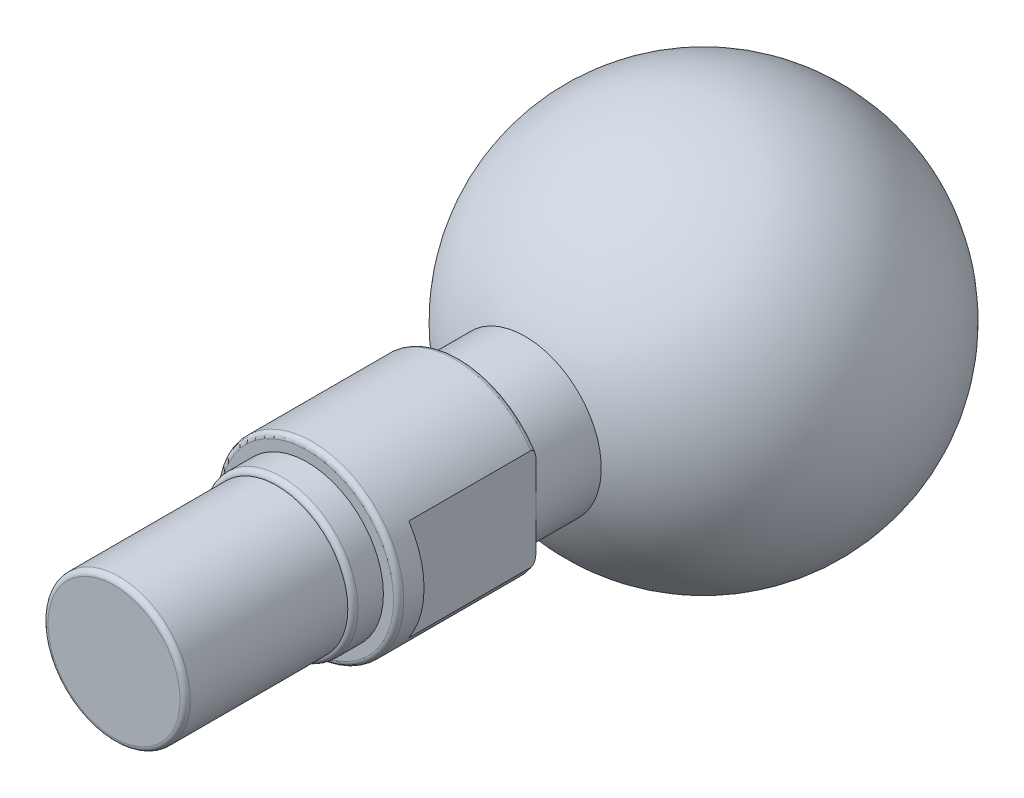
ISO-10303-21;
HEADER;
FILE_DESCRIPTION(('STEP AP214'),'2;1');
FILE_NAME('part.step','',(''),(''),'','','');
FILE_SCHEMA(('AUTOMOTIVE_DESIGN { 1 0 10303 214 1 1 1 1 }'));
ENDSEC;
DATA;
#1=APPLICATION_CONTEXT('core data for automotive mechanical design processes');
#2=APPLICATION_PROTOCOL_DEFINITION('international standard','automotive_design',2000,#1);
#3=PRODUCT_CONTEXT('',#1,'mechanical');
#4=PRODUCT('Part','Part','',(#3));
#5=PRODUCT_RELATED_PRODUCT_CATEGORY('part','',(#4));
#6=PRODUCT_DEFINITION_FORMATION('','',#4);
#7=PRODUCT_DEFINITION_CONTEXT('part definition',#1,'design');
#8=PRODUCT_DEFINITION('design','',#6,#7);
#9=PRODUCT_DEFINITION_SHAPE('','',#8);
#10=(LENGTH_UNIT() NAMED_UNIT(*) SI_UNIT(.MILLI.,.METRE.));
#11=(NAMED_UNIT(*) PLANE_ANGLE_UNIT() SI_UNIT($,.RADIAN.));
#12=(NAMED_UNIT(*) SI_UNIT($,.STERADIAN.) SOLID_ANGLE_UNIT());
#13=UNCERTAINTY_MEASURE_WITH_UNIT(LENGTH_MEASURE(1.E-05),#10,'distance_accuracy_value','');
#14=(GEOMETRIC_REPRESENTATION_CONTEXT(3) GLOBAL_UNCERTAINTY_ASSIGNED_CONTEXT((#13)) GLOBAL_UNIT_ASSIGNED_CONTEXT((#10,
#11,#12)) REPRESENTATION_CONTEXT('',''));
#15=CARTESIAN_POINT('',(0.,0.,0.));
#16=DIRECTION('',(0.,0.,1.));
#17=DIRECTION('',(1.,0.,0.));
#18=AXIS2_PLACEMENT_3D('',#15,#16,#17);
#19=CARTESIAN_POINT('',(0.,0.,48.));
#20=DIRECTION('',(0.,0.,-1.));
#21=DIRECTION('',(-1.,0.,0.));
#22=AXIS2_PLACEMENT_3D('',#19,#20,#21);
#23=PLANE('',#22);
#24=DIRECTION('',(0.,-1.,0.));
#25=VECTOR('',#24,1.);
#26=CARTESIAN_POINT('',(-15.,0.,48.));
#27=LINE('',#26,#25);
#28=CARTESIAN_POINT('',(-15.,7.99999999999999,48.));
#29=VERTEX_POINT('',#28);
#30=CARTESIAN_POINT('',(-15.,0.,48.));
#31=VERTEX_POINT('',#30);
#32=EDGE_CURVE('E120',#29,#31,#27,.T.);
#33=ORIENTED_EDGE('',*,*,#32,.F.);
#34=CARTESIAN_POINT('',(0.,0.,48.));
#35=DIRECTION('',(0.,0.,-1.));
#36=DIRECTION('',(-1.,0.,0.));
#37=AXIS2_PLACEMENT_3D('',#34,#35,#36);
#38=CIRCLE('',#37,17.);
#39=CARTESIAN_POINT('',(15.,7.99999999999999,48.));
#40=VERTEX_POINT('',#39);
#41=EDGE_CURVE('E156',#29,#40,#38,.T.);
#42=ORIENTED_EDGE('',*,*,#41,.T.);
#43=DIRECTION('',(0.,1.,0.));
#44=VECTOR('',#43,1.);
#45=CARTESIAN_POINT('',(15.,0.,48.));
#46=LINE('',#45,#44);
#47=CARTESIAN_POINT('',(15.,0.,48.));
#48=VERTEX_POINT('',#47);
#49=EDGE_CURVE('E143',#48,#40,#46,.T.);
#50=ORIENTED_EDGE('',*,*,#49,.F.);
#51=CARTESIAN_POINT('',(0.,0.,48.));
#52=DIRECTION('',(0.,0.,-1.));
#53=DIRECTION('',(-1.,0.,0.));
#54=AXIS2_PLACEMENT_3D('',#51,#52,#53);
#55=CIRCLE('',#54,15.);
#56=EDGE_CURVE('E133',#31,#48,#55,.T.);
#57=ORIENTED_EDGE('',*,*,#56,.F.);
#58=EDGE_LOOP('',(#33,#42,#50,#57));
#59=FACE_BOUND('',#58,.T.);
#60=ADVANCED_FACE('F43',(#59),#23,.T.);
#61=CARTESIAN_POINT('',(0.,0.,48.));
#62=DIRECTION('',(0.,0.,-1.));
#63=DIRECTION('',(-1.,0.,0.));
#64=AXIS2_PLACEMENT_3D('',#61,#62,#63);
#65=CYLINDRICAL_SURFACE('',#64,15.);
#66=ORIENTED_EDGE('',*,*,#56,.T.);
#67=EDGE_CURVE('E137',#48,#31,#55,.T.);
#68=ORIENTED_EDGE('',*,*,#67,.T.);
#69=EDGE_LOOP('',(#66,#68));
#70=FACE_BOUND('',#69,.T.);
#71=CARTESIAN_POINT('',(0.,0.,35.1317520200744));
#72=DIRECTION('',(0.,0.,-1.));
#73=DIRECTION('',(-1.,0.,0.));
#74=AXIS2_PLACEMENT_3D('',#71,#72,#73);
#75=CIRCLE('',#74,15.);
#76=CARTESIAN_POINT('',(-15.,0.,35.1317520200744));
#77=VERTEX_POINT('',#76);
#78=EDGE_CURVE('E132',#77,#77,#75,.F.);
#79=ORIENTED_EDGE('',*,*,#78,.T.);
#80=EDGE_LOOP('',(#79));
#81=FACE_BOUND('',#80,.T.);
#82=ADVANCED_FACE('F184',(#70,#81),#65,.T.);
#83=CARTESIAN_POINT('',(0.,0.,116.));
#84=DIRECTION('',(0.,0.,-1.));
#85=DIRECTION('',(-1.,0.,0.));
#86=AXIS2_PLACEMENT_3D('',#83,#84,#85);
#87=CYLINDRICAL_SURFACE('',#86,18.);
#88=CARTESIAN_POINT('',(0.,0.,77.));
#89=DIRECTION('',(0.,0.,1.));
#90=DIRECTION('',(1.,0.,0.));
#91=AXIS2_PLACEMENT_3D('',#88,#89,#90);
#92=CIRCLE('',#91,18.);
#93=CARTESIAN_POINT('',(18.,0.,77.));
#94=VERTEX_POINT('',#93);
#95=EDGE_CURVE('E166',#94,#94,#92,.F.);
#96=ORIENTED_EDGE('',*,*,#95,.T.);
#97=EDGE_LOOP('',(#96));
#98=FACE_BOUND('',#97,.T.);
#99=DIRECTION('',(0.,0.,-1.));
#100=VECTOR('',#99,1.);
#101=CARTESIAN_POINT('',(-15.,-9.9498743710662,116.));
#102=LINE('',#101,#100);
#103=CARTESIAN_POINT('',(-15.,-9.9498743710662,73.));
#104=VERTEX_POINT('',#103);
#105=CARTESIAN_POINT('',(-15.,-9.9498743710662,49.));
#106=VERTEX_POINT('',#105);
#107=EDGE_CURVE('E130',#104,#106,#102,.T.);
#108=ORIENTED_EDGE('',*,*,#107,.T.);
#109=CARTESIAN_POINT('',(0.,0.,49.));
#110=DIRECTION('',(0.,0.,-1.));
#111=DIRECTION('',(-1.,0.,0.));
#112=AXIS2_PLACEMENT_3D('',#109,#110,#111);
#113=CIRCLE('',#112,18.);
#114=CARTESIAN_POINT('',(15.,-9.9498743710662,49.));
#115=VERTEX_POINT('',#114);
#116=EDGE_CURVE('E57',#106,#115,#113,.F.);
#117=ORIENTED_EDGE('',*,*,#116,.T.);
#118=DIRECTION('',(0.,0.,-1.));
#119=VECTOR('',#118,1.);
#120=CARTESIAN_POINT('',(15.,-9.9498743710662,116.));
#121=LINE('',#120,#119);
#122=CARTESIAN_POINT('',(15.,-9.9498743710662,73.));
#123=VERTEX_POINT('',#122);
#124=EDGE_CURVE('E104',#115,#123,#121,.F.);
#125=ORIENTED_EDGE('',*,*,#124,.T.);
#126=CARTESIAN_POINT('',(0.,0.,73.));
#127=DIRECTION('',(0.,0.,-1.));
#128=DIRECTION('',(-1.,0.,0.));
#129=AXIS2_PLACEMENT_3D('',#126,#127,#128);
#130=CIRCLE('',#129,18.);
#131=CARTESIAN_POINT('',(15.,9.9498743710662,73.));
#132=VERTEX_POINT('',#131);
#133=EDGE_CURVE('E108',#132,#123,#130,.T.);
#134=ORIENTED_EDGE('',*,*,#133,.F.);
#135=DIRECTION('',(0.,0.,-1.));
#136=VECTOR('',#135,1.);
#137=CARTESIAN_POINT('',(15.,9.9498743710662,116.));
#138=LINE('',#137,#136);
#139=CARTESIAN_POINT('',(15.,9.9498743710662,49.));
#140=VERTEX_POINT('',#139);
#141=EDGE_CURVE('E112',#132,#140,#138,.T.);
#142=ORIENTED_EDGE('',*,*,#141,.T.);
#143=CARTESIAN_POINT('',(0.,0.,49.));
#144=DIRECTION('',(0.,0.,-1.));
#145=DIRECTION('',(-1.,0.,0.));
#146=AXIS2_PLACEMENT_3D('',#143,#144,#145);
#147=CIRCLE('',#146,18.);
#148=CARTESIAN_POINT('',(-15.,9.9498743710662,49.));
#149=VERTEX_POINT('',#148);
#150=EDGE_CURVE('E233',#140,#149,#147,.F.);
#151=ORIENTED_EDGE('',*,*,#150,.T.);
#152=DIRECTION('',(0.,0.,-1.));
#153=VECTOR('',#152,1.);
#154=CARTESIAN_POINT('',(-15.,9.9498743710662,116.));
#155=LINE('',#154,#153);
#156=CARTESIAN_POINT('',(-15.,9.9498743710662,73.));
#157=VERTEX_POINT('',#156);
#158=EDGE_CURVE('E128',#149,#157,#155,.F.);
#159=ORIENTED_EDGE('',*,*,#158,.T.);
#160=CARTESIAN_POINT('',(0.,0.,73.));
#161=DIRECTION('',(0.,0.,1.));
#162=DIRECTION('',(1.,0.,0.));
#163=AXIS2_PLACEMENT_3D('',#160,#161,#162);
#164=CIRCLE('',#163,18.);
#165=EDGE_CURVE('E119',#157,#104,#164,.T.);
#166=ORIENTED_EDGE('',*,*,#165,.T.);
#167=EDGE_LOOP('',(#108,#117,#125,#134,#142,#151,#159,#166));
#168=FACE_BOUND('',#167,.T.);
#169=ADVANCED_FACE('F106',(#98,#168),#87,.T.);
#170=CARTESIAN_POINT('',(0.,0.,78.));
#171=DIRECTION('',(0.,0.,1.));
#172=DIRECTION('',(1.,0.,0.));
#173=AXIS2_PLACEMENT_3D('',#170,#171,#172);
#174=CYLINDRICAL_SURFACE('',#173,15.);
#175=CARTESIAN_POINT('',(0.,0.,83.));
#176=DIRECTION('',(0.,0.,1.));
#177=DIRECTION('',(1.,0.,0.));
#178=AXIS2_PLACEMENT_3D('',#175,#176,#177);
#179=CIRCLE('',#178,15.);
#180=CARTESIAN_POINT('',(15.,0.,83.));
#181=VERTEX_POINT('',#180);
#182=EDGE_CURVE('E153',#181,#181,#179,.F.);
#183=ORIENTED_EDGE('',*,*,#182,.T.);
#184=EDGE_LOOP('',(#183));
#185=FACE_BOUND('',#184,.T.);
#186=CARTESIAN_POINT('',(0.,0.,78.));
#187=DIRECTION('',(0.,0.,1.));
#188=DIRECTION('',(1.,0.,0.));
#189=AXIS2_PLACEMENT_3D('',#186,#187,#188);
#190=CIRCLE('',#189,15.);
#191=CARTESIAN_POINT('',(15.,0.,78.));
#192=VERTEX_POINT('',#191);
#193=EDGE_CURVE('E140',#192,#192,#190,.T.);
#194=ORIENTED_EDGE('',*,*,#193,.T.);
#195=EDGE_LOOP('',(#194));
#196=FACE_BOUND('',#195,.T.);
#197=ADVANCED_FACE('F197',(#185,#196),#174,.T.);
#198=CARTESIAN_POINT('',(0.,0.,78.));
#199=DIRECTION('',(0.,0.,1.));
#200=DIRECTION('',(1.,0.,0.));
#201=AXIS2_PLACEMENT_3D('',#198,#199,#200);
#202=PLANE('',#201);
#203=CARTESIAN_POINT('',(0.,0.,78.));
#204=DIRECTION('',(0.,0.,1.));
#205=DIRECTION('',(1.,0.,0.));
#206=AXIS2_PLACEMENT_3D('',#203,#204,#205);
#207=CIRCLE('',#206,17.);
#208=CARTESIAN_POINT('',(17.,0.,78.));
#209=VERTEX_POINT('',#208);
#210=EDGE_CURVE('E258',#209,#209,#207,.T.);
#211=ORIENTED_EDGE('',*,*,#210,.T.);
#212=EDGE_LOOP('',(#211));
#213=FACE_BOUND('',#212,.T.);
#214=ORIENTED_EDGE('',*,*,#193,.F.);
#215=EDGE_LOOP('',(#214));
#216=FACE_BOUND('',#215,.T.);
#217=ADVANCED_FACE('F195',(#213,#216),#202,.T.);
#218=CARTESIAN_POINT('',(0.,0.,84.));
#219=DIRECTION('',(0.,0.,1.));
#220=DIRECTION('',(1.,0.,0.));
#221=AXIS2_PLACEMENT_3D('',#218,#219,#220);
#222=CYLINDRICAL_SURFACE('',#221,14.);
#223=CARTESIAN_POINT('',(0.,0.,115.));
#224=DIRECTION('',(0.,0.,1.));
#225=DIRECTION('',(1.,0.,0.));
#226=AXIS2_PLACEMENT_3D('',#223,#224,#225);
#227=CIRCLE('',#226,14.);
#228=CARTESIAN_POINT('',(14.,0.,115.));
#229=VERTEX_POINT('',#228);
#230=EDGE_CURVE('E263',#229,#229,#227,.F.);
#231=ORIENTED_EDGE('',*,*,#230,.T.);
#232=EDGE_LOOP('',(#231));
#233=FACE_BOUND('',#232,.T.);
#234=CARTESIAN_POINT('',(0.,0.,84.));
#235=DIRECTION('',(0.,0.,1.));
#236=DIRECTION('',(1.,0.,0.));
#237=AXIS2_PLACEMENT_3D('',#234,#235,#236);
#238=CIRCLE('',#237,14.);
#239=CARTESIAN_POINT('',(14.,0.,84.));
#240=VERTEX_POINT('',#239);
#241=EDGE_CURVE('E136',#240,#240,#238,.T.);
#242=ORIENTED_EDGE('',*,*,#241,.T.);
#243=EDGE_LOOP('',(#242));
#244=FACE_BOUND('',#243,.T.);
#245=ADVANCED_FACE('F192',(#233,#244),#222,.T.);
#246=CARTESIAN_POINT('',(0.,0.,116.));
#247=DIRECTION('',(0.,0.,1.));
#248=DIRECTION('',(1.,0.,0.));
#249=AXIS2_PLACEMENT_3D('',#246,#247,#248);
#250=PLANE('',#249);
#251=CARTESIAN_POINT('',(0.,0.,116.));
#252=DIRECTION('',(0.,0.,1.));
#253=DIRECTION('',(1.,0.,0.));
#254=AXIS2_PLACEMENT_3D('',#251,#252,#253);
#255=CIRCLE('',#254,13.);
#256=CARTESIAN_POINT('',(13.,0.,116.));
#257=VERTEX_POINT('',#256);
#258=EDGE_CURVE('E261',#257,#257,#255,.T.);
#259=ORIENTED_EDGE('',*,*,#258,.T.);
#260=EDGE_LOOP('',(#259));
#261=FACE_BOUND('',#260,.T.);
#262=ADVANCED_FACE('F190',(#261),#250,.T.);
#263=CARTESIAN_POINT('',(15.,-7.99999999999999,48.));
#264=VERTEX_POINT('',#263);
#265=EDGE_CURVE('E148',#264,#48,#46,.T.);
#266=ORIENTED_EDGE('',*,*,#265,.F.);
#267=CARTESIAN_POINT('',(0.,0.,48.));
#268=DIRECTION('',(0.,0.,-1.));
#269=DIRECTION('',(-1.,0.,0.));
#270=AXIS2_PLACEMENT_3D('',#267,#268,#269);
#271=CIRCLE('',#270,17.);
#272=CARTESIAN_POINT('',(-15.,-7.99999999999999,48.));
#273=VERTEX_POINT('',#272);
#274=EDGE_CURVE('E241',#264,#273,#271,.T.);
#275=ORIENTED_EDGE('',*,*,#274,.T.);
#276=EDGE_CURVE('E149',#31,#273,#27,.T.);
#277=ORIENTED_EDGE('',*,*,#276,.F.);
#278=ORIENTED_EDGE('',*,*,#67,.F.);
#279=EDGE_LOOP('',(#266,#275,#277,#278));
#280=FACE_BOUND('',#279,.T.);
#281=ADVANCED_FACE('F182',(#280),#23,.T.);
#282=CARTESIAN_POINT('',(0.,0.,0.));
#283=DIRECTION('',(0.,1.,0.));
#284=DIRECTION('',(-1.,0.,0.));
#285=AXIS2_PLACEMENT_3D('',#282,#283,#284);
#286=SPHERICAL_SURFACE('',#285,38.2);
#287=CARTESIAN_POINT('',(0.,0.,0.));
#288=DIRECTION('',(0.,0.,-1.));
#289=DIRECTION('',(-1.,0.,0.));
#290=AXIS2_PLACEMENT_3D('',#287,#288,#289);
#291=SPHERICAL_SURFACE('',#290,38.2);
#292=ORIENTED_EDGE('',*,*,#78,.F.);
#293=EDGE_LOOP('',(#292));
#294=FACE_BOUND('',#293,.T.);
#295=ADVANCED_FACE('F178',(#294),#291,.T.);
#296=CARTESIAN_POINT('',(0.,0.,73.));
#297=DIRECTION('',(0.,0.,-1.));
#298=DIRECTION('',(-1.,0.,0.));
#299=AXIS2_PLACEMENT_3D('',#296,#297,#298);
#300=PLANE('',#299);
#301=ORIENTED_EDGE('',*,*,#133,.T.);
#302=DIRECTION('',(0.,1.,0.));
#303=VECTOR('',#302,1.);
#304=CARTESIAN_POINT('',(15.,-37.868854143312,73.));
#305=LINE('',#304,#303);
#306=EDGE_CURVE('E118',#123,#132,#305,.T.);
#307=ORIENTED_EDGE('',*,*,#306,.T.);
#308=EDGE_LOOP('',(#301,#307));
#309=FACE_BOUND('',#308,.T.);
#310=ADVANCED_FACE('F117',(#309),#300,.T.);
#311=CARTESIAN_POINT('',(15.,0.,73.));
#312=DIRECTION('',(-1.,0.,0.));
#313=DIRECTION('',(0.,0.,1.));
#314=AXIS2_PLACEMENT_3D('',#311,#312,#313);
#315=PLANE('',#314);
#316=ORIENTED_EDGE('',*,*,#124,.F.);
#317=CARTESIAN_POINT('',(15.,-9.9498743710662,49.));
#318=CARTESIAN_POINT('',(15.,-9.94995092068547,48.9670104016146));
#319=CARTESIAN_POINT('',(15.,-9.94692576620746,48.9341030484418));
#320=CARTESIAN_POINT('',(15.,-9.935340034861,48.86955140071));
#321=CARTESIAN_POINT('',(15.,-9.92682641291096,48.8378987874545));
#322=CARTESIAN_POINT('',(15.,-9.90494267054541,48.7764569813644));
#323=CARTESIAN_POINT('',(15.,-9.89158627466595,48.7466627986246));
#324=CARTESIAN_POINT('',(15.,-9.86085445183833,48.689178639946));
#325=CARTESIAN_POINT('',(15.,-9.84347004976157,48.6614935492632));
#326=CARTESIAN_POINT('',(15.,-9.79306405669942,48.5910530607561));
#327=CARTESIAN_POINT('',(15.,-9.75725518298242,48.5502944985032));
#328=CARTESIAN_POINT('',(15.,-9.67977213133022,48.474803925843));
#329=CARTESIAN_POINT('',(15.,-9.63808239893143,48.4400884613369));
#330=CARTESIAN_POINT('',(15.,-9.55791381191183,48.3812738741146));
#331=CARTESIAN_POINT('',(15.,-9.52001697597254,48.356366491592));
#332=CARTESIAN_POINT('',(15.,-9.44220485638635,48.3099099583812));
#333=CARTESIAN_POINT('',(15.,-9.40228817549255,48.288363175672));
#334=CARTESIAN_POINT('',(15.,-9.28021748138049,48.2281411850536));
#335=CARTESIAN_POINT('',(15.,-9.19584289893816,48.1939534125173));
#336=CARTESIAN_POINT('',(15.,-9.03047350057519,48.1374840412098));
#337=CARTESIAN_POINT('',(15.,-8.9497079454855,48.1144959132503));
#338=CARTESIAN_POINT('',(15.,-8.7864581921727,48.0754482260719));
#339=CARTESIAN_POINT('',(15.,-8.70397249354183,48.0593950056331));
#340=CARTESIAN_POINT('',(15.,-8.53811653529296,48.0333167196097));
#341=CARTESIAN_POINT('',(15.,-8.45474665229676,48.0232891846372));
#342=CARTESIAN_POINT('',(15.,-8.28754112006985,48.0085695036277));
#343=CARTESIAN_POINT('',(15.,-8.20370547214922,48.0038773425912));
#344=CARTESIAN_POINT('',(15.,-8.09984208725256,48.0010694075162));
#345=CARTESIAN_POINT('',(15.,-8.07985843046174,48.0006667855147));
#346=CARTESIAN_POINT('',(15.,-8.03991683750419,48.0001322507617));
#347=CARTESIAN_POINT('',(15.,-8.01995890666298,47.9999999413284));
#348=CARTESIAN_POINT('',(15.,-7.99999999999999,48.));
#349=B_SPLINE_CURVE_WITH_KNOTS('',3,(#317,#318,#319,#320,#321,#322,#323,#324,#325,#326,#327,
#328,#329,#330,#331,#332,#333,#334,#335,#336,#337,#338,#339,#340,#341,#342,#343,#344,#345,#346,
#347,#348),.UNSPECIFIED.,.F.,.F.,(4,2,2,2,2,2,2,2,2,2,2,2,2,2,2,4),(0.,0.0986996653338462,
0.196565944000477,0.294157007880505,0.391967649816215,0.553799433585078,0.716067569401041,
0.851921403090914,0.987870535129685,1.26012968437189,1.51173247577786,1.76356475799105,
2.01529376623782,2.26702206679281,2.32698441529393,2.38685870606055),.UNSPECIFIED.);
#350=EDGE_CURVE('E11',#115,#264,#349,.T.);
#351=ORIENTED_EDGE('',*,*,#350,.T.);
#352=ORIENTED_EDGE('',*,*,#265,.T.);
#353=ORIENTED_EDGE('',*,*,#49,.T.);
#354=CARTESIAN_POINT('',(15.,7.99999999999999,48.));
#355=CARTESIAN_POINT('',(15.,8.08388043308083,48.0000301285647));
#356=CARTESIAN_POINT('',(15.,8.16779721708657,48.0023404220549));
#357=CARTESIAN_POINT('',(15.,8.33557003476502,48.0120827100263));
#358=CARTESIAN_POINT('',(15.,8.41942519548885,48.0195294541275));
#359=CARTESIAN_POINT('',(15.,8.58694845254498,48.0401732366046));
#360=CARTESIAN_POINT('',(15.,8.6706124909832,48.0534041116134));
#361=CARTESIAN_POINT('',(15.,8.83655530782762,48.0864390853219));
#362=CARTESIAN_POINT('',(15.,8.91883577516349,48.1062344493247));
#363=CARTESIAN_POINT('',(15.,9.06405890014056,48.1485582391874));
#364=CARTESIAN_POINT('',(15.,9.12742247468199,48.1696314549044));
#365=CARTESIAN_POINT('',(15.,9.2520438292776,48.2173551503201));
#366=CARTESIAN_POINT('',(15.,9.31330195457422,48.2440047105052));
#367=CARTESIAN_POINT('',(15.,9.43304054144105,48.3040913888168));
#368=CARTESIAN_POINT('',(15.,9.49149584844016,48.3375794215359));
#369=CARTESIAN_POINT('',(15.,9.6031495939962,48.4124735848139));
#370=CARTESIAN_POINT('',(15.,9.65635784394322,48.4538644951771));
#371=CARTESIAN_POINT('',(15.,9.7354478582526,48.5282611252012));
#372=CARTESIAN_POINT('',(15.,9.76399712406904,48.5584181186283));
#373=CARTESIAN_POINT('',(15.,9.81660127804363,48.6224705324718));
#374=CARTESIAN_POINT('',(15.,9.84065975529899,48.6563629327451));
#375=CARTESIAN_POINT('',(15.,9.87957559354778,48.7224129512661));
#376=CARTESIAN_POINT('',(15.,9.89527083640601,48.7540722987884));
#377=CARTESIAN_POINT('',(15.,9.92117447432434,48.8195375536959));
#378=CARTESIAN_POINT('',(15.,9.93139647419635,48.853337902867));
#379=CARTESIAN_POINT('',(15.,9.94221243884038,48.9062071171034));
#380=CARTESIAN_POINT('',(15.,9.94507308522225,48.9248308600835));
#381=CARTESIAN_POINT('',(15.,9.94890869835182,48.9622984646423));
#382=CARTESIAN_POINT('',(15.,9.94988088343938,48.9811426098594));
#383=CARTESIAN_POINT('',(15.,9.9498743710662,49.));
#384=B_SPLINE_CURVE_WITH_KNOTS('',3,(#354,#355,#356,#357,#358,#359,#360,#361,#362,#363,#364,
#365,#366,#367,#368,#369,#370,#371,#372,#373,#374,#375,#376,#377,#378,#379,#380,#381,#382,#383),
.UNSPECIFIED.,.F.,.F.,(4,2,2,2,2,2,2,2,2,2,2,2,2,2,4),(0.,0.251665998590591,0.504057696012981,
0.757946042855831,1.01149791283583,1.21161383770568,1.41169679034393,1.61332761313456,
1.81457396105758,1.9388408768163,2.06300804756233,2.16861049642969,2.27394921667853,
2.33038892897095,2.38691171281139),.UNSPECIFIED.);
#385=EDGE_CURVE('E159',#40,#140,#384,.T.);
#386=ORIENTED_EDGE('',*,*,#385,.T.);
#387=ORIENTED_EDGE('',*,*,#141,.F.);
#388=ORIENTED_EDGE('',*,*,#306,.F.);
#389=EDGE_LOOP('',(#316,#351,#352,#353,#386,#387,#388));
#390=FACE_BOUND('',#389,.T.);
#391=ADVANCED_FACE('F122',(#390),#315,.F.);
#392=CARTESIAN_POINT('',(0.,0.,73.));
#393=DIRECTION('',(0.,0.,1.));
#394=DIRECTION('',(1.,0.,0.));
#395=AXIS2_PLACEMENT_3D('',#392,#393,#394);
#396=PLANE('',#395);
#397=DIRECTION('',(0.,-1.,0.));
#398=VECTOR('',#397,1.);
#399=CARTESIAN_POINT('',(-15.,-37.868854143312,73.));
#400=LINE('',#399,#398);
#401=EDGE_CURVE('E113',#157,#104,#400,.T.);
#402=ORIENTED_EDGE('',*,*,#401,.T.);
#403=ORIENTED_EDGE('',*,*,#165,.F.);
#404=EDGE_LOOP('',(#402,#403));
#405=FACE_BOUND('',#404,.T.);
#406=ADVANCED_FACE('F176',(#405),#396,.F.);
#407=CARTESIAN_POINT('',(-15.,0.,73.));
#408=DIRECTION('',(1.,0.,0.));
#409=DIRECTION('',(0.,0.,-1.));
#410=AXIS2_PLACEMENT_3D('',#407,#408,#409);
#411=PLANE('',#410);
#412=ORIENTED_EDGE('',*,*,#276,.T.);
#413=CARTESIAN_POINT('',(-15.,-7.99999999999999,48.));
#414=CARTESIAN_POINT('',(-15.,-8.08388043308083,48.0000301285647));
#415=CARTESIAN_POINT('',(-15.,-8.16779721708657,48.0023404220549));
#416=CARTESIAN_POINT('',(-15.,-8.33557003476502,48.0120827100263));
#417=CARTESIAN_POINT('',(-15.,-8.41942519548885,48.0195294541275));
#418=CARTESIAN_POINT('',(-15.,-8.58694845254498,48.0401732366046));
#419=CARTESIAN_POINT('',(-15.,-8.6706124909832,48.0534041116134));
#420=CARTESIAN_POINT('',(-15.,-8.83655530782762,48.0864390853219));
#421=CARTESIAN_POINT('',(-15.,-8.91883577516349,48.1062344493247));
#422=CARTESIAN_POINT('',(-15.,-9.06405890014056,48.1485582391874));
#423=CARTESIAN_POINT('',(-15.,-9.12742247468199,48.1696314549044));
#424=CARTESIAN_POINT('',(-15.,-9.2520438292776,48.2173551503201));
#425=CARTESIAN_POINT('',(-15.,-9.31330195457422,48.2440047105052));
#426=CARTESIAN_POINT('',(-15.,-9.43304054144105,48.3040913888168));
#427=CARTESIAN_POINT('',(-15.,-9.49149584844016,48.3375794215359));
#428=CARTESIAN_POINT('',(-15.,-9.6031495939962,48.4124735848139));
#429=CARTESIAN_POINT('',(-15.,-9.65635784394322,48.4538644951771));
#430=CARTESIAN_POINT('',(-15.,-9.7354478582526,48.5282611252012));
#431=CARTESIAN_POINT('',(-15.,-9.76399712406904,48.5584181186283));
#432=CARTESIAN_POINT('',(-15.,-9.81660127804363,48.6224705324718));
#433=CARTESIAN_POINT('',(-15.,-9.84065975529899,48.6563629327451));
#434=CARTESIAN_POINT('',(-15.,-9.87957559354778,48.7224129512661));
#435=CARTESIAN_POINT('',(-15.,-9.89527083640601,48.7540722987884));
#436=CARTESIAN_POINT('',(-15.,-9.92117447432434,48.8195375536959));
#437=CARTESIAN_POINT('',(-15.,-9.93139647419635,48.853337902867));
#438=CARTESIAN_POINT('',(-15.,-9.94221243884038,48.9062071171034));
#439=CARTESIAN_POINT('',(-15.,-9.94507308522225,48.9248308600835));
#440=CARTESIAN_POINT('',(-15.,-9.94890869835182,48.9622984646423));
#441=CARTESIAN_POINT('',(-15.,-9.94988088343938,48.9811426098594));
#442=CARTESIAN_POINT('',(-15.,-9.9498743710662,49.));
#443=B_SPLINE_CURVE_WITH_KNOTS('',3,(#413,#414,#415,#416,#417,#418,#419,#420,#421,#422,#423,
#424,#425,#426,#427,#428,#429,#430,#431,#432,#433,#434,#435,#436,#437,#438,#439,#440,#441,#442),
.UNSPECIFIED.,.F.,.F.,(4,2,2,2,2,2,2,2,2,2,2,2,2,2,4),(0.,0.251665998590591,0.504057696012981,
0.757946042855831,1.01149791283583,1.21161383770568,1.41169679034393,1.61332761313456,
1.81457396105758,1.9388408768163,2.06300804756233,2.16861049642969,2.27394921667853,
2.33038892897095,2.38691171281139),.UNSPECIFIED.);
#444=EDGE_CURVE('E71',#273,#106,#443,.T.);
#445=ORIENTED_EDGE('',*,*,#444,.T.);
#446=ORIENTED_EDGE('',*,*,#107,.F.);
#447=ORIENTED_EDGE('',*,*,#401,.F.);
#448=ORIENTED_EDGE('',*,*,#158,.F.);
#449=CARTESIAN_POINT('',(-15.,9.9498743710662,49.));
#450=CARTESIAN_POINT('',(-15.,9.94995092068547,48.9670104016146));
#451=CARTESIAN_POINT('',(-15.,9.94692576620746,48.9341030484418));
#452=CARTESIAN_POINT('',(-15.,9.935340034861,48.86955140071));
#453=CARTESIAN_POINT('',(-15.,9.92682641291096,48.8378987874545));
#454=CARTESIAN_POINT('',(-15.,9.90494267054541,48.7764569813644));
#455=CARTESIAN_POINT('',(-15.,9.89158627466595,48.7466627986246));
#456=CARTESIAN_POINT('',(-15.,9.86085445183833,48.689178639946));
#457=CARTESIAN_POINT('',(-15.,9.84347004976157,48.6614935492632));
#458=CARTESIAN_POINT('',(-15.,9.79306405669942,48.5910530607561));
#459=CARTESIAN_POINT('',(-15.,9.75725518298242,48.5502944985032));
#460=CARTESIAN_POINT('',(-15.,9.67977213133022,48.474803925843));
#461=CARTESIAN_POINT('',(-15.,9.63808239893143,48.4400884613369));
#462=CARTESIAN_POINT('',(-15.,9.55791381191183,48.3812738741146));
#463=CARTESIAN_POINT('',(-15.,9.52001697597254,48.356366491592));
#464=CARTESIAN_POINT('',(-15.,9.44220485638635,48.3099099583812));
#465=CARTESIAN_POINT('',(-15.,9.40228817549255,48.288363175672));
#466=CARTESIAN_POINT('',(-15.,9.28021748138049,48.2281411850536));
#467=CARTESIAN_POINT('',(-15.,9.19584289893816,48.1939534125173));
#468=CARTESIAN_POINT('',(-15.,9.03047350057519,48.1374840412098));
#469=CARTESIAN_POINT('',(-15.,8.9497079454855,48.1144959132503));
#470=CARTESIAN_POINT('',(-15.,8.7864581921727,48.0754482260719));
#471=CARTESIAN_POINT('',(-15.,8.70397249354183,48.0593950056331));
#472=CARTESIAN_POINT('',(-15.,8.53811653529296,48.0333167196097));
#473=CARTESIAN_POINT('',(-15.,8.45474665229676,48.0232891846372));
#474=CARTESIAN_POINT('',(-15.,8.28754112006985,48.0085695036277));
#475=CARTESIAN_POINT('',(-15.,8.20370547214922,48.0038773425912));
#476=CARTESIAN_POINT('',(-15.,8.09984208725256,48.0010694075162));
#477=CARTESIAN_POINT('',(-15.,8.07985843046174,48.0006667855147));
#478=CARTESIAN_POINT('',(-15.,8.03991683750419,48.0001322507617));
#479=CARTESIAN_POINT('',(-15.,8.01995890666298,47.9999999413284));
#480=CARTESIAN_POINT('',(-15.,7.99999999999999,48.));
#481=B_SPLINE_CURVE_WITH_KNOTS('',3,(#449,#450,#451,#452,#453,#454,#455,#456,#457,#458,#459,
#460,#461,#462,#463,#464,#465,#466,#467,#468,#469,#470,#471,#472,#473,#474,#475,#476,#477,#478,
#479,#480),.UNSPECIFIED.,.F.,.F.,(4,2,2,2,2,2,2,2,2,2,2,2,2,2,2,4),(0.,0.0986996653338462,
0.196565944000477,0.294157007880505,0.391967649816215,0.553799433585078,0.716067569401041,
0.851921403090914,0.987870535129685,1.26012968437189,1.51173247577786,1.76356475799105,
2.01529376623782,2.26702206679281,2.32698441529393,2.38685870606055),.UNSPECIFIED.);
#482=EDGE_CURVE('E232',#149,#29,#481,.T.);
#483=ORIENTED_EDGE('',*,*,#482,.T.);
#484=ORIENTED_EDGE('',*,*,#32,.T.);
#485=EDGE_LOOP('',(#412,#445,#446,#447,#448,#483,#484));
#486=FACE_BOUND('',#485,.T.);
#487=ADVANCED_FACE('F211',(#486),#411,.F.);
#488=CARTESIAN_POINT('',(0.,0.,83.));
#489=DIRECTION('',(0.,0.,1.));
#490=DIRECTION('',(1.,0.,0.));
#491=AXIS2_PLACEMENT_3D('',#488,#489,#490);
#492=TOROIDAL_SURFACE('',#491,14.,1.);
#493=ORIENTED_EDGE('',*,*,#182,.F.);
#494=EDGE_LOOP('',(#493));
#495=FACE_BOUND('',#494,.T.);
#496=ORIENTED_EDGE('',*,*,#241,.F.);
#497=EDGE_LOOP('',(#496));
#498=FACE_BOUND('',#497,.T.);
#499=ADVANCED_FACE('F209',(#495,#498),#492,.T.);
#500=CARTESIAN_POINT('',(0.,0.,49.));
#501=DIRECTION('',(0.,0.,-1.));
#502=DIRECTION('',(-1.,0.,0.));
#503=AXIS2_PLACEMENT_3D('',#500,#501,#502);
#504=TOROIDAL_SURFACE('',#503,17.,1.);
#505=ORIENTED_EDGE('',*,*,#482,.F.);
#506=ORIENTED_EDGE('',*,*,#150,.F.);
#507=ORIENTED_EDGE('',*,*,#385,.F.);
#508=ORIENTED_EDGE('',*,*,#41,.F.);
#509=EDGE_LOOP('',(#505,#506,#507,#508));
#510=FACE_BOUND('',#509,.T.);
#511=ADVANCED_FACE('F168',(#510),#504,.T.);
#512=CARTESIAN_POINT('',(0.,0.,77.));
#513=DIRECTION('',(0.,0.,1.));
#514=DIRECTION('',(1.,0.,0.));
#515=AXIS2_PLACEMENT_3D('',#512,#513,#514);
#516=TOROIDAL_SURFACE('',#515,17.,1.);
#517=ORIENTED_EDGE('',*,*,#95,.F.);
#518=EDGE_LOOP('',(#517));
#519=FACE_BOUND('',#518,.T.);
#520=ORIENTED_EDGE('',*,*,#210,.F.);
#521=EDGE_LOOP('',(#520));
#522=FACE_BOUND('',#521,.T.);
#523=ADVANCED_FACE('F217',(#519,#522),#516,.T.);
#524=CARTESIAN_POINT('',(0.,0.,115.));
#525=DIRECTION('',(0.,0.,1.));
#526=DIRECTION('',(1.,0.,0.));
#527=AXIS2_PLACEMENT_3D('',#524,#525,#526);
#528=TOROIDAL_SURFACE('',#527,13.,1.);
#529=ORIENTED_EDGE('',*,*,#230,.F.);
#530=EDGE_LOOP('',(#529));
#531=FACE_BOUND('',#530,.T.);
#532=ORIENTED_EDGE('',*,*,#258,.F.);
#533=EDGE_LOOP('',(#532));
#534=FACE_BOUND('',#533,.T.);
#535=ADVANCED_FACE('F273',(#531,#534),#528,.T.);
#536=CARTESIAN_POINT('',(0.,0.,49.));
#537=DIRECTION('',(0.,0.,-1.));
#538=DIRECTION('',(-1.,0.,0.));
#539=AXIS2_PLACEMENT_3D('',#536,#537,#538);
#540=TOROIDAL_SURFACE('',#539,17.,1.);
#541=ORIENTED_EDGE('',*,*,#350,.F.);
#542=ORIENTED_EDGE('',*,*,#116,.F.);
#543=ORIENTED_EDGE('',*,*,#444,.F.);
#544=ORIENTED_EDGE('',*,*,#274,.F.);
#545=EDGE_LOOP('',(#541,#542,#543,#544));
#546=FACE_BOUND('',#545,.T.);
#547=ADVANCED_FACE('F45',(#546),#540,.T.);
#548=CLOSED_SHELL('',(#60,#82,#169,#197,#217,#245,#262,#281,#295,#310,#391,#406,#487,#499,#511,
#523,#535,#547));
#549=MANIFOLD_SOLID_BREP('B2',#548);
#550=ADVANCED_BREP_SHAPE_REPRESENTATION('',(#18,#549),#14);
#551=SHAPE_DEFINITION_REPRESENTATION(#9,#550);
ENDSEC;
END-ISO-10303-21;
